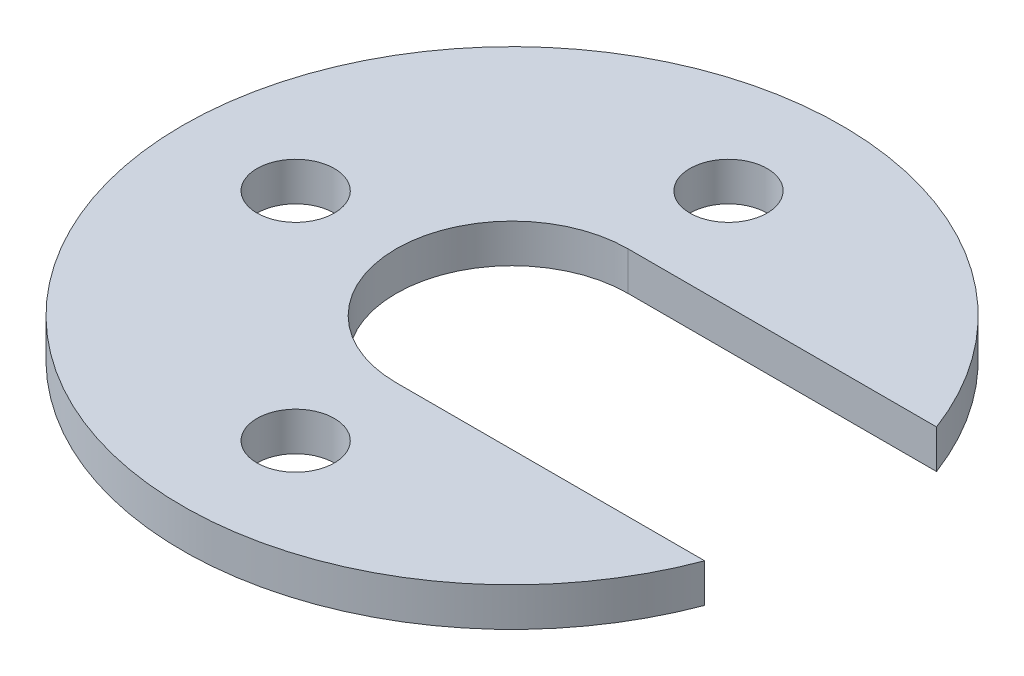
ISO-10303-21;
HEADER;
FILE_DESCRIPTION(('STEP AP214'),'2;1');
FILE_NAME('part.step','',(''),(''),'','','');
FILE_SCHEMA(('AUTOMOTIVE_DESIGN { 1 0 10303 214 1 1 1 1 }'));
ENDSEC;
DATA;
#1=APPLICATION_CONTEXT('core data for automotive mechanical design processes');
#2=APPLICATION_PROTOCOL_DEFINITION('international standard','automotive_design',2000,#1);
#3=PRODUCT_CONTEXT('',#1,'mechanical');
#4=PRODUCT('Part','Part','',(#3));
#5=PRODUCT_RELATED_PRODUCT_CATEGORY('part','',(#4));
#6=PRODUCT_DEFINITION_FORMATION('','',#4);
#7=PRODUCT_DEFINITION_CONTEXT('part definition',#1,'design');
#8=PRODUCT_DEFINITION('design','',#6,#7);
#9=PRODUCT_DEFINITION_SHAPE('','',#8);
#10=(LENGTH_UNIT() NAMED_UNIT(*) SI_UNIT(.MILLI.,.METRE.));
#11=(NAMED_UNIT(*) PLANE_ANGLE_UNIT() SI_UNIT($,.RADIAN.));
#12=(NAMED_UNIT(*) SI_UNIT($,.STERADIAN.) SOLID_ANGLE_UNIT());
#13=UNCERTAINTY_MEASURE_WITH_UNIT(LENGTH_MEASURE(1.E-05),#10,'distance_accuracy_value','');
#14=(GEOMETRIC_REPRESENTATION_CONTEXT(3) GLOBAL_UNCERTAINTY_ASSIGNED_CONTEXT((#13)) GLOBAL_UNIT_ASSIGNED_CONTEXT((#10,
#11,#12)) REPRESENTATION_CONTEXT('',''));
#15=CARTESIAN_POINT('',(0.,0.,0.));
#16=DIRECTION('',(0.,0.,1.));
#17=DIRECTION('',(1.,0.,0.));
#18=AXIS2_PLACEMENT_3D('',#15,#16,#17);
#19=CARTESIAN_POINT('',(0.,5.,0.));
#20=DIRECTION('',(0.,1.,0.));
#21=DIRECTION('',(0.,0.,1.));
#22=AXIS2_PLACEMENT_3D('',#19,#20,#21);
#23=PLANE('',#22);
#24=CARTESIAN_POINT('',(0.,5.,28.));
#25=DIRECTION('',(0.,1.,0.));
#26=DIRECTION('',(0.,0.,1.));
#27=AXIS2_PLACEMENT_3D('',#24,#25,#26);
#28=CIRCLE('',#27,5.);
#29=CARTESIAN_POINT('',(0.,5.,33.));
#30=VERTEX_POINT('',#29);
#31=EDGE_CURVE('E134',#30,#30,#28,.T.);
#32=ORIENTED_EDGE('',*,*,#31,.F.);
#33=EDGE_LOOP('',(#32));
#34=FACE_BOUND('',#33,.T.);
#35=CARTESIAN_POINT('',(0.,5.,0.));
#36=DIRECTION('',(0.,-1.,0.));
#37=DIRECTION('',(0.,0.,1.));
#38=AXIS2_PLACEMENT_3D('',#35,#36,#37);
#39=CIRCLE('',#38,15.);
#40=CARTESIAN_POINT('',(0.,5.,15.));
#41=VERTEX_POINT('',#40);
#42=CARTESIAN_POINT('',(0.,5.,-15.));
#43=VERTEX_POINT('',#42);
#44=EDGE_CURVE('E92',#41,#43,#39,.T.);
#45=ORIENTED_EDGE('',*,*,#44,.T.);
#46=DIRECTION('',(1.,0.,0.));
#47=VECTOR('',#46,1.);
#48=CARTESIAN_POINT('',(0.,5.,-15.));
#49=LINE('',#48,#47);
#50=CARTESIAN_POINT('',(39.9171569597726,5.,-15.));
#51=VERTEX_POINT('',#50);
#52=EDGE_CURVE('E87',#43,#51,#49,.T.);
#53=ORIENTED_EDGE('',*,*,#52,.T.);
#54=CARTESIAN_POINT('',(0.,5.,0.));
#55=DIRECTION('',(0.,1.,0.));
#56=DIRECTION('',(0.,0.,1.));
#57=AXIS2_PLACEMENT_3D('',#54,#55,#56);
#58=CIRCLE('',#57,42.6424602919569);
#59=CARTESIAN_POINT('',(39.9171569597726,5.,15.));
#60=VERTEX_POINT('',#59);
#61=EDGE_CURVE('E90',#51,#60,#58,.T.);
#62=ORIENTED_EDGE('',*,*,#61,.T.);
#63=DIRECTION('',(-1.,0.,0.));
#64=VECTOR('',#63,1.);
#65=CARTESIAN_POINT('',(0.,5.,15.));
#66=LINE('',#65,#64);
#67=EDGE_CURVE('E57',#60,#41,#66,.T.);
#68=ORIENTED_EDGE('',*,*,#67,.T.);
#69=EDGE_LOOP('',(#45,#53,#62,#68));
#70=FACE_BOUND('',#69,.T.);
#71=CARTESIAN_POINT('',(0.,5.,-28.));
#72=DIRECTION('',(0.,1.,0.));
#73=DIRECTION('',(0.,0.,1.));
#74=AXIS2_PLACEMENT_3D('',#71,#72,#73);
#75=CIRCLE('',#74,5.);
#76=CARTESIAN_POINT('',(0.,5.,-23.));
#77=VERTEX_POINT('',#76);
#78=EDGE_CURVE('E112',#77,#77,#75,.T.);
#79=ORIENTED_EDGE('',*,*,#78,.F.);
#80=EDGE_LOOP('',(#79));
#81=FACE_BOUND('',#80,.T.);
#82=CARTESIAN_POINT('',(-28.,5.,0.));
#83=DIRECTION('',(0.,1.,0.));
#84=DIRECTION('',(0.,0.,1.));
#85=AXIS2_PLACEMENT_3D('',#82,#83,#84);
#86=CIRCLE('',#85,5.);
#87=CARTESIAN_POINT('',(-28.,5.,5.));
#88=VERTEX_POINT('',#87);
#89=EDGE_CURVE('E142',#88,#88,#86,.T.);
#90=ORIENTED_EDGE('',*,*,#89,.F.);
#91=EDGE_LOOP('',(#90));
#92=FACE_BOUND('',#91,.T.);
#93=ADVANCED_FACE('F39',(#34,#70,#81,#92),#23,.T.);
#94=CARTESIAN_POINT('',(0.,0.,0.));
#95=DIRECTION('',(0.,1.,0.));
#96=DIRECTION('',(0.,0.,1.));
#97=AXIS2_PLACEMENT_3D('',#94,#95,#96);
#98=PLANE('',#97);
#99=CARTESIAN_POINT('',(0.,0.,0.));
#100=DIRECTION('',(0.,-1.,0.));
#101=DIRECTION('',(0.,0.,1.));
#102=AXIS2_PLACEMENT_3D('',#99,#100,#101);
#103=CIRCLE('',#102,15.);
#104=CARTESIAN_POINT('',(0.,0.,15.));
#105=VERTEX_POINT('',#104);
#106=CARTESIAN_POINT('',(0.,0.,-15.));
#107=VERTEX_POINT('',#106);
#108=EDGE_CURVE('E108',#105,#107,#103,.T.);
#109=ORIENTED_EDGE('',*,*,#108,.F.);
#110=DIRECTION('',(-1.,0.,0.));
#111=VECTOR('',#110,1.);
#112=CARTESIAN_POINT('',(0.,0.,15.));
#113=LINE('',#112,#111);
#114=CARTESIAN_POINT('',(39.9171569597726,0.,15.));
#115=VERTEX_POINT('',#114);
#116=EDGE_CURVE('E80',#115,#105,#113,.T.);
#117=ORIENTED_EDGE('',*,*,#116,.F.);
#118=CARTESIAN_POINT('',(0.,0.,0.));
#119=DIRECTION('',(0.,1.,0.));
#120=DIRECTION('',(0.,0.,1.));
#121=AXIS2_PLACEMENT_3D('',#118,#119,#120);
#122=CIRCLE('',#121,42.6424602919569);
#123=CARTESIAN_POINT('',(39.9171569597726,0.,-15.));
#124=VERTEX_POINT('',#123);
#125=EDGE_CURVE('E74',#124,#115,#122,.T.);
#126=ORIENTED_EDGE('',*,*,#125,.F.);
#127=DIRECTION('',(1.,0.,0.));
#128=VECTOR('',#127,1.);
#129=CARTESIAN_POINT('',(0.,0.,-15.));
#130=LINE('',#129,#128);
#131=EDGE_CURVE('E97',#107,#124,#130,.T.);
#132=ORIENTED_EDGE('',*,*,#131,.F.);
#133=EDGE_LOOP('',(#109,#117,#126,#132));
#134=FACE_BOUND('',#133,.T.);
#135=CARTESIAN_POINT('',(0.,0.,-28.));
#136=DIRECTION('',(0.,1.,0.));
#137=DIRECTION('',(0.,0.,1.));
#138=AXIS2_PLACEMENT_3D('',#135,#136,#137);
#139=CIRCLE('',#138,5.);
#140=CARTESIAN_POINT('',(0.,0.,-23.));
#141=VERTEX_POINT('',#140);
#142=EDGE_CURVE('E130',#141,#141,#139,.T.);
#143=ORIENTED_EDGE('',*,*,#142,.T.);
#144=EDGE_LOOP('',(#143));
#145=FACE_BOUND('',#144,.T.);
#146=CARTESIAN_POINT('',(0.,0.,28.));
#147=DIRECTION('',(0.,1.,0.));
#148=DIRECTION('',(0.,0.,1.));
#149=AXIS2_PLACEMENT_3D('',#146,#147,#148);
#150=CIRCLE('',#149,5.);
#151=CARTESIAN_POINT('',(0.,0.,33.));
#152=VERTEX_POINT('',#151);
#153=EDGE_CURVE('E138',#152,#152,#150,.T.);
#154=ORIENTED_EDGE('',*,*,#153,.T.);
#155=EDGE_LOOP('',(#154));
#156=FACE_BOUND('',#155,.T.);
#157=CARTESIAN_POINT('',(-28.,0.,0.));
#158=DIRECTION('',(0.,1.,0.));
#159=DIRECTION('',(0.,0.,1.));
#160=AXIS2_PLACEMENT_3D('',#157,#158,#159);
#161=CIRCLE('',#160,5.);
#162=CARTESIAN_POINT('',(-28.,0.,5.));
#163=VERTEX_POINT('',#162);
#164=EDGE_CURVE('E146',#163,#163,#161,.T.);
#165=ORIENTED_EDGE('',*,*,#164,.T.);
#166=EDGE_LOOP('',(#165));
#167=FACE_BOUND('',#166,.T.);
#168=ADVANCED_FACE('F125',(#134,#145,#156,#167),#98,.F.);
#169=CARTESIAN_POINT('',(0.,5.,0.));
#170=DIRECTION('',(0.,-1.,0.));
#171=DIRECTION('',(0.,0.,-1.));
#172=AXIS2_PLACEMENT_3D('',#169,#170,#171);
#173=CYLINDRICAL_SURFACE('',#172,15.);
#174=ORIENTED_EDGE('',*,*,#108,.T.);
#175=DIRECTION('',(0.,-1.,0.));
#176=VECTOR('',#175,1.);
#177=CARTESIAN_POINT('',(0.,5.,-15.));
#178=LINE('',#177,#176);
#179=EDGE_CURVE('E11',#43,#107,#178,.T.);
#180=ORIENTED_EDGE('',*,*,#179,.F.);
#181=ORIENTED_EDGE('',*,*,#44,.F.);
#182=DIRECTION('',(0.,-1.,0.));
#183=VECTOR('',#182,1.);
#184=CARTESIAN_POINT('',(0.,5.,15.));
#185=LINE('',#184,#183);
#186=EDGE_CURVE('E104',#41,#105,#185,.T.);
#187=ORIENTED_EDGE('',*,*,#186,.T.);
#188=EDGE_LOOP('',(#174,#180,#181,#187));
#189=FACE_BOUND('',#188,.T.);
#190=ADVANCED_FACE('F41',(#189),#173,.F.);
#191=CARTESIAN_POINT('',(0.,5.,-15.));
#192=DIRECTION('',(0.,0.,-1.));
#193=DIRECTION('',(-1.,0.,0.));
#194=AXIS2_PLACEMENT_3D('',#191,#192,#193);
#195=PLANE('',#194);
#196=ORIENTED_EDGE('',*,*,#131,.T.);
#197=DIRECTION('',(0.,-1.,0.));
#198=VECTOR('',#197,1.);
#199=CARTESIAN_POINT('',(39.9171569597726,5.,-15.));
#200=LINE('',#199,#198);
#201=EDGE_CURVE('E49',#51,#124,#200,.T.);
#202=ORIENTED_EDGE('',*,*,#201,.F.);
#203=ORIENTED_EDGE('',*,*,#52,.F.);
#204=ORIENTED_EDGE('',*,*,#179,.T.);
#205=EDGE_LOOP('',(#196,#202,#203,#204));
#206=FACE_BOUND('',#205,.T.);
#207=ADVANCED_FACE('F96',(#206),#195,.F.);
#208=CARTESIAN_POINT('',(0.,5.,0.));
#209=DIRECTION('',(0.,-1.,0.));
#210=DIRECTION('',(0.,0.,-1.));
#211=AXIS2_PLACEMENT_3D('',#208,#209,#210);
#212=CYLINDRICAL_SURFACE('',#211,42.6424602919569);
#213=ORIENTED_EDGE('',*,*,#125,.T.);
#214=DIRECTION('',(0.,-1.,0.));
#215=VECTOR('',#214,1.);
#216=CARTESIAN_POINT('',(39.9171569597726,5.,15.));
#217=LINE('',#216,#215);
#218=EDGE_CURVE('E99',#60,#115,#217,.T.);
#219=ORIENTED_EDGE('',*,*,#218,.F.);
#220=ORIENTED_EDGE('',*,*,#61,.F.);
#221=ORIENTED_EDGE('',*,*,#201,.T.);
#222=EDGE_LOOP('',(#213,#219,#220,#221));
#223=FACE_BOUND('',#222,.T.);
#224=ADVANCED_FACE('F100',(#223),#212,.T.);
#225=CARTESIAN_POINT('',(0.,5.,15.));
#226=DIRECTION('',(0.,0.,1.));
#227=DIRECTION('',(1.,0.,0.));
#228=AXIS2_PLACEMENT_3D('',#225,#226,#227);
#229=PLANE('',#228);
#230=ORIENTED_EDGE('',*,*,#116,.T.);
#231=ORIENTED_EDGE('',*,*,#186,.F.);
#232=ORIENTED_EDGE('',*,*,#67,.F.);
#233=ORIENTED_EDGE('',*,*,#218,.T.);
#234=EDGE_LOOP('',(#230,#231,#232,#233));
#235=FACE_BOUND('',#234,.T.);
#236=ADVANCED_FACE('F122',(#235),#229,.F.);
#237=CARTESIAN_POINT('',(0.,5.,-28.));
#238=DIRECTION('',(0.,-1.,0.));
#239=DIRECTION('',(0.,0.,-1.));
#240=AXIS2_PLACEMENT_3D('',#237,#238,#239);
#241=CYLINDRICAL_SURFACE('',#240,5.);
#242=ORIENTED_EDGE('',*,*,#78,.T.);
#243=EDGE_LOOP('',(#242));
#244=FACE_BOUND('',#243,.T.);
#245=ORIENTED_EDGE('',*,*,#142,.F.);
#246=EDGE_LOOP('',(#245));
#247=FACE_BOUND('',#246,.T.);
#248=ADVANCED_FACE('F166',(#244,#247),#241,.F.);
#249=CARTESIAN_POINT('',(0.,5.,28.));
#250=DIRECTION('',(0.,-1.,0.));
#251=DIRECTION('',(0.,0.,-1.));
#252=AXIS2_PLACEMENT_3D('',#249,#250,#251);
#253=CYLINDRICAL_SURFACE('',#252,5.);
#254=ORIENTED_EDGE('',*,*,#31,.T.);
#255=EDGE_LOOP('',(#254));
#256=FACE_BOUND('',#255,.T.);
#257=ORIENTED_EDGE('',*,*,#153,.F.);
#258=EDGE_LOOP('',(#257));
#259=FACE_BOUND('',#258,.T.);
#260=ADVANCED_FACE('F212',(#256,#259),#253,.F.);
#261=CARTESIAN_POINT('',(-28.,5.,0.));
#262=DIRECTION('',(0.,-1.,0.));
#263=DIRECTION('',(0.,0.,-1.));
#264=AXIS2_PLACEMENT_3D('',#261,#262,#263);
#265=CYLINDRICAL_SURFACE('',#264,5.);
#266=ORIENTED_EDGE('',*,*,#89,.T.);
#267=EDGE_LOOP('',(#266));
#268=FACE_BOUND('',#267,.T.);
#269=ORIENTED_EDGE('',*,*,#164,.F.);
#270=EDGE_LOOP('',(#269));
#271=FACE_BOUND('',#270,.T.);
#272=ADVANCED_FACE('F154',(#268,#271),#265,.F.);
#273=CLOSED_SHELL('',(#93,#168,#190,#207,#224,#236,#248,#260,#272));
#274=MANIFOLD_SOLID_BREP('B2',#273);
#275=ADVANCED_BREP_SHAPE_REPRESENTATION('',(#18,#274),#14);
#276=SHAPE_DEFINITION_REPRESENTATION(#9,#275);
ENDSEC;
END-ISO-10303-21;
